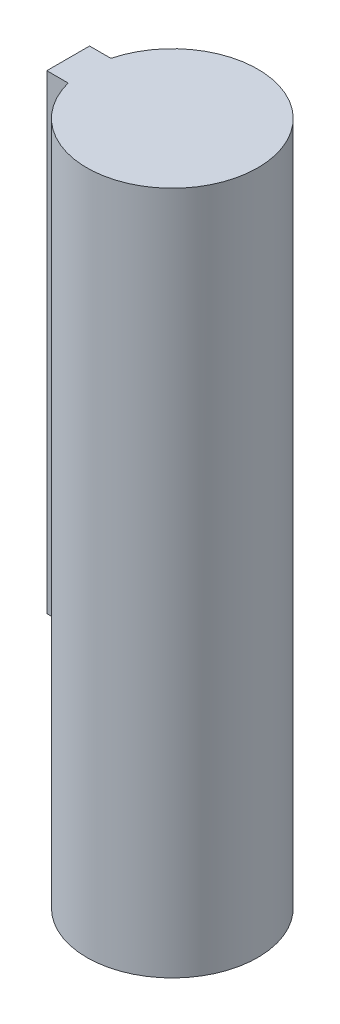
ISO-10303-21;
HEADER;
FILE_DESCRIPTION(('STEP AP214'),'2;1');
FILE_NAME('part.step','',(''),(''),'','','');
FILE_SCHEMA(('AUTOMOTIVE_DESIGN { 1 0 10303 214 1 1 1 1 }'));
ENDSEC;
DATA;
#1=APPLICATION_CONTEXT('core data for automotive mechanical design processes');
#2=APPLICATION_PROTOCOL_DEFINITION('international standard','automotive_design',2000,#1);
#3=PRODUCT_CONTEXT('',#1,'mechanical');
#4=PRODUCT('Part','Part','',(#3));
#5=PRODUCT_RELATED_PRODUCT_CATEGORY('part','',(#4));
#6=PRODUCT_DEFINITION_FORMATION('','',#4);
#7=PRODUCT_DEFINITION_CONTEXT('part definition',#1,'design');
#8=PRODUCT_DEFINITION('design','',#6,#7);
#9=PRODUCT_DEFINITION_SHAPE('','',#8);
#10=(LENGTH_UNIT() NAMED_UNIT(*) SI_UNIT(.MILLI.,.METRE.));
#11=(NAMED_UNIT(*) PLANE_ANGLE_UNIT() SI_UNIT($,.RADIAN.));
#12=(NAMED_UNIT(*) SI_UNIT($,.STERADIAN.) SOLID_ANGLE_UNIT());
#13=UNCERTAINTY_MEASURE_WITH_UNIT(LENGTH_MEASURE(1.E-05),#10,'distance_accuracy_value','');
#14=(GEOMETRIC_REPRESENTATION_CONTEXT(3) GLOBAL_UNCERTAINTY_ASSIGNED_CONTEXT((#13)) GLOBAL_UNIT_ASSIGNED_CONTEXT((#10,
#11,#12)) REPRESENTATION_CONTEXT('',''));
#15=CARTESIAN_POINT('',(0.,0.,0.));
#16=DIRECTION('',(0.,0.,1.));
#17=DIRECTION('',(1.,0.,0.));
#18=AXIS2_PLACEMENT_3D('',#15,#16,#17);
#19=CARTESIAN_POINT('',(0.,80.,0.));
#20=DIRECTION('',(0.,-1.,0.));
#21=DIRECTION('',(0.,0.,-1.));
#22=AXIS2_PLACEMENT_3D('',#19,#20,#21);
#23=CYLINDRICAL_SURFACE('',#22,20.);
#24=CARTESIAN_POINT('',(0.,-80.,0.));
#25=DIRECTION('',(0.,1.,0.));
#26=DIRECTION('',(0.,0.,1.));
#27=AXIS2_PLACEMENT_3D('',#24,#25,#26);
#28=CIRCLE('',#27,20.);
#29=CARTESIAN_POINT('',(0.,-80.,20.));
#30=VERTEX_POINT('',#29);
#31=EDGE_CURVE('E41',#30,#30,#28,.T.);
#32=ORIENTED_EDGE('',*,*,#31,.T.);
#33=EDGE_LOOP('',(#32));
#34=FACE_BOUND('',#33,.T.);
#35=DIRECTION('',(0.,1.,0.));
#36=VECTOR('',#35,1.);
#37=CARTESIAN_POINT('',(-19.3649167310371,-30.,5.));
#38=LINE('',#37,#36);
#39=CARTESIAN_POINT('',(-19.3649167310371,-30.,5.));
#40=VERTEX_POINT('',#39);
#41=CARTESIAN_POINT('',(-19.3649167310371,80.,5.));
#42=VERTEX_POINT('',#41);
#43=EDGE_CURVE('E95',#40,#42,#38,.T.);
#44=ORIENTED_EDGE('',*,*,#43,.F.);
#45=CARTESIAN_POINT('',(0.,-30.,0.));
#46=DIRECTION('',(0.,1.,0.));
#47=DIRECTION('',(0.,0.,1.));
#48=AXIS2_PLACEMENT_3D('',#45,#46,#47);
#49=CIRCLE('',#48,20.);
#50=CARTESIAN_POINT('',(-19.3649167310371,-30.,-5.));
#51=VERTEX_POINT('',#50);
#52=EDGE_CURVE('E82',#51,#40,#49,.T.);
#53=ORIENTED_EDGE('',*,*,#52,.F.);
#54=DIRECTION('',(0.,1.,0.));
#55=VECTOR('',#54,1.);
#56=CARTESIAN_POINT('',(-19.3649167310371,-30.,-5.));
#57=LINE('',#56,#55);
#58=CARTESIAN_POINT('',(-19.3649167310371,80.,-5.));
#59=VERTEX_POINT('',#58);
#60=EDGE_CURVE('E87',#51,#59,#57,.T.);
#61=ORIENTED_EDGE('',*,*,#60,.T.);
#62=CARTESIAN_POINT('',(0.,80.,0.));
#63=DIRECTION('',(0.,1.,0.));
#64=DIRECTION('',(0.,0.,1.));
#65=AXIS2_PLACEMENT_3D('',#62,#63,#64);
#66=CIRCLE('',#65,20.);
#67=EDGE_CURVE('E11',#42,#59,#66,.T.);
#68=ORIENTED_EDGE('',*,*,#67,.F.);
#69=EDGE_LOOP('',(#44,#53,#61,#68));
#70=FACE_BOUND('',#69,.T.);
#71=ADVANCED_FACE('F38',(#34,#70),#23,.T.);
#72=CARTESIAN_POINT('',(0.,80.,0.));
#73=DIRECTION('',(0.,1.,0.));
#74=DIRECTION('',(0.,0.,1.));
#75=AXIS2_PLACEMENT_3D('',#72,#73,#74);
#76=PLANE('',#75);
#77=ORIENTED_EDGE('',*,*,#67,.T.);
#78=DIRECTION('',(-1.,0.,0.));
#79=VECTOR('',#78,1.);
#80=CARTESIAN_POINT('',(0.,80.,-5.));
#81=LINE('',#80,#79);
#82=CARTESIAN_POINT('',(-24.3649167310371,80.,-5.));
#83=VERTEX_POINT('',#82);
#84=EDGE_CURVE('E91',#59,#83,#81,.T.);
#85=ORIENTED_EDGE('',*,*,#84,.T.);
#86=DIRECTION('',(0.,0.,1.));
#87=VECTOR('',#86,1.);
#88=CARTESIAN_POINT('',(-24.3649167310371,80.,0.));
#89=LINE('',#88,#87);
#90=CARTESIAN_POINT('',(-24.3649167310371,80.,5.));
#91=VERTEX_POINT('',#90);
#92=EDGE_CURVE('E102',#83,#91,#89,.T.);
#93=ORIENTED_EDGE('',*,*,#92,.T.);
#94=DIRECTION('',(-1.,0.,0.));
#95=VECTOR('',#94,1.);
#96=CARTESIAN_POINT('',(0.,80.,5.));
#97=LINE('',#96,#95);
#98=EDGE_CURVE('E51',#42,#91,#97,.T.);
#99=ORIENTED_EDGE('',*,*,#98,.F.);
#100=EDGE_LOOP('',(#77,#85,#93,#99));
#101=FACE_BOUND('',#100,.T.);
#102=ADVANCED_FACE('F113',(#101),#76,.T.);
#103=CARTESIAN_POINT('',(0.,-80.,0.));
#104=DIRECTION('',(0.,1.,0.));
#105=DIRECTION('',(0.,0.,1.));
#106=AXIS2_PLACEMENT_3D('',#103,#104,#105);
#107=PLANE('',#106);
#108=ORIENTED_EDGE('',*,*,#31,.F.);
#109=EDGE_LOOP('',(#108));
#110=FACE_BOUND('',#109,.T.);
#111=ADVANCED_FACE('F122',(#110),#107,.F.);
#112=CARTESIAN_POINT('',(0.,-30.,5.));
#113=DIRECTION('',(0.,0.,-1.));
#114=DIRECTION('',(-1.,0.,0.));
#115=AXIS2_PLACEMENT_3D('',#112,#113,#114);
#116=PLANE('',#115);
#117=ORIENTED_EDGE('',*,*,#98,.T.);
#118=DIRECTION('',(0.,1.,0.));
#119=VECTOR('',#118,1.);
#120=CARTESIAN_POINT('',(-24.3649167310371,-30.,5.));
#121=LINE('',#120,#119);
#122=CARTESIAN_POINT('',(-24.3649167310371,-30.,5.));
#123=VERTEX_POINT('',#122);
#124=EDGE_CURVE('E78',#123,#91,#121,.T.);
#125=ORIENTED_EDGE('',*,*,#124,.F.);
#126=DIRECTION('',(-1.,0.,0.));
#127=VECTOR('',#126,1.);
#128=CARTESIAN_POINT('',(0.,-30.,5.));
#129=LINE('',#128,#127);
#130=EDGE_CURVE('E60',#40,#123,#129,.T.);
#131=ORIENTED_EDGE('',*,*,#130,.F.);
#132=ORIENTED_EDGE('',*,*,#43,.T.);
#133=EDGE_LOOP('',(#117,#125,#131,#132));
#134=FACE_BOUND('',#133,.T.);
#135=ADVANCED_FACE('F112',(#134),#116,.F.);
#136=CARTESIAN_POINT('',(-24.3649167310371,-30.,0.));
#137=DIRECTION('',(-1.,0.,0.));
#138=DIRECTION('',(0.,0.,1.));
#139=AXIS2_PLACEMENT_3D('',#136,#137,#138);
#140=PLANE('',#139);
#141=ORIENTED_EDGE('',*,*,#92,.F.);
#142=DIRECTION('',(0.,1.,0.));
#143=VECTOR('',#142,1.);
#144=CARTESIAN_POINT('',(-24.3649167310371,-30.,-5.));
#145=LINE('',#144,#143);
#146=CARTESIAN_POINT('',(-24.3649167310371,-30.,-5.));
#147=VERTEX_POINT('',#146);
#148=EDGE_CURVE('E94',#147,#83,#145,.T.);
#149=ORIENTED_EDGE('',*,*,#148,.F.);
#150=DIRECTION('',(0.,0.,1.));
#151=VECTOR('',#150,1.);
#152=CARTESIAN_POINT('',(-24.3649167310371,-30.,0.));
#153=LINE('',#152,#151);
#154=EDGE_CURVE('E98',#147,#123,#153,.T.);
#155=ORIENTED_EDGE('',*,*,#154,.T.);
#156=ORIENTED_EDGE('',*,*,#124,.T.);
#157=EDGE_LOOP('',(#141,#149,#155,#156));
#158=FACE_BOUND('',#157,.T.);
#159=ADVANCED_FACE('F114',(#158),#140,.T.);
#160=CARTESIAN_POINT('',(0.,-30.,-5.));
#161=DIRECTION('',(0.,0.,-1.));
#162=DIRECTION('',(-1.,0.,0.));
#163=AXIS2_PLACEMENT_3D('',#160,#161,#162);
#164=PLANE('',#163);
#165=ORIENTED_EDGE('',*,*,#84,.F.);
#166=ORIENTED_EDGE('',*,*,#60,.F.);
#167=DIRECTION('',(-1.,0.,0.));
#168=VECTOR('',#167,1.);
#169=CARTESIAN_POINT('',(0.,-30.,-5.));
#170=LINE('',#169,#168);
#171=EDGE_CURVE('E89',#51,#147,#170,.T.);
#172=ORIENTED_EDGE('',*,*,#171,.T.);
#173=ORIENTED_EDGE('',*,*,#148,.T.);
#174=EDGE_LOOP('',(#165,#166,#172,#173));
#175=FACE_BOUND('',#174,.T.);
#176=ADVANCED_FACE('F88',(#175),#164,.T.);
#177=CARTESIAN_POINT('',(0.,-30.,0.));
#178=DIRECTION('',(0.,1.,0.));
#179=DIRECTION('',(0.,0.,1.));
#180=AXIS2_PLACEMENT_3D('',#177,#178,#179);
#181=PLANE('',#180);
#182=ORIENTED_EDGE('',*,*,#130,.T.);
#183=ORIENTED_EDGE('',*,*,#154,.F.);
#184=ORIENTED_EDGE('',*,*,#171,.F.);
#185=ORIENTED_EDGE('',*,*,#52,.T.);
#186=EDGE_LOOP('',(#182,#183,#184,#185));
#187=FACE_BOUND('',#186,.T.);
#188=ADVANCED_FACE('F97',(#187),#181,.F.);
#189=CLOSED_SHELL('',(#71,#102,#111,#135,#159,#176,#188));
#190=MANIFOLD_SOLID_BREP('B2',#189);
#191=ADVANCED_BREP_SHAPE_REPRESENTATION('',(#18,#190),#14);
#192=SHAPE_DEFINITION_REPRESENTATION(#9,#191);
ENDSEC;
END-ISO-10303-21;
